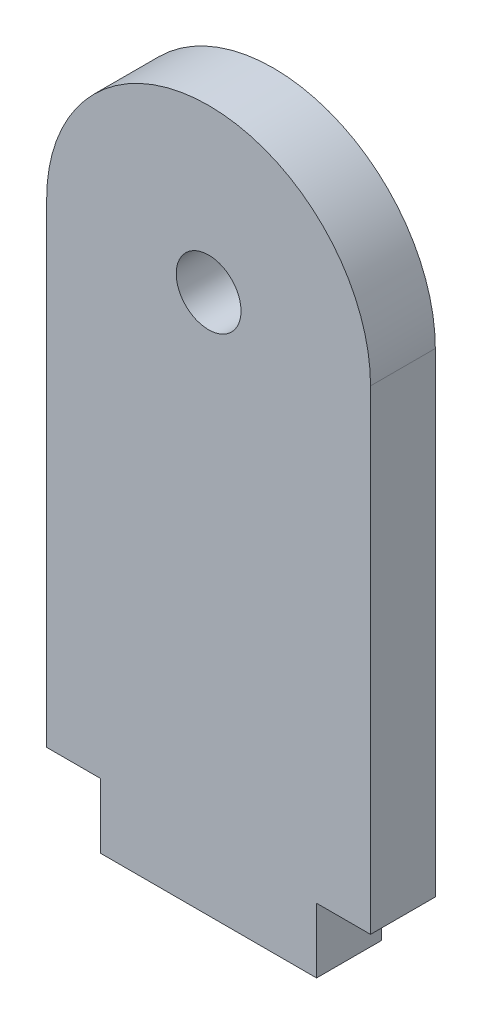
ISO-10303-21;
HEADER;
FILE_DESCRIPTION(('STEP AP214'),'2;1');
FILE_NAME('part.step','',(''),(''),'','','');
FILE_SCHEMA(('AUTOMOTIVE_DESIGN { 1 0 10303 214 1 1 1 1 }'));
ENDSEC;
DATA;
#1=APPLICATION_CONTEXT('core data for automotive mechanical design processes');
#2=APPLICATION_PROTOCOL_DEFINITION('international standard','automotive_design',2000,#1);
#3=PRODUCT_CONTEXT('',#1,'mechanical');
#4=PRODUCT('Part','Part','',(#3));
#5=PRODUCT_RELATED_PRODUCT_CATEGORY('part','',(#4));
#6=PRODUCT_DEFINITION_FORMATION('','',#4);
#7=PRODUCT_DEFINITION_CONTEXT('part definition',#1,'design');
#8=PRODUCT_DEFINITION('design','',#6,#7);
#9=PRODUCT_DEFINITION_SHAPE('','',#8);
#10=(LENGTH_UNIT() NAMED_UNIT(*) SI_UNIT(.MILLI.,.METRE.));
#11=(NAMED_UNIT(*) PLANE_ANGLE_UNIT() SI_UNIT($,.RADIAN.));
#12=(NAMED_UNIT(*) SI_UNIT($,.STERADIAN.) SOLID_ANGLE_UNIT());
#13=UNCERTAINTY_MEASURE_WITH_UNIT(LENGTH_MEASURE(1.E-05),#10,'distance_accuracy_value','');
#14=(GEOMETRIC_REPRESENTATION_CONTEXT(3) GLOBAL_UNCERTAINTY_ASSIGNED_CONTEXT((#13)) GLOBAL_UNIT_ASSIGNED_CONTEXT((#10,
#11,#12)) REPRESENTATION_CONTEXT('',''));
#15=CARTESIAN_POINT('',(0.,0.,0.));
#16=DIRECTION('',(0.,0.,1.));
#17=DIRECTION('',(1.,0.,0.));
#18=AXIS2_PLACEMENT_3D('',#15,#16,#17);
#19=CARTESIAN_POINT('',(12.5,0.,3.));
#20=DIRECTION('',(1.,0.,0.));
#21=DIRECTION('',(0.,0.,-1.));
#22=AXIS2_PLACEMENT_3D('',#19,#20,#21);
#23=PLANE('',#22);
#24=DIRECTION('',(0.,-1.,0.));
#25=VECTOR('',#24,1.);
#26=CARTESIAN_POINT('',(12.5,0.,0.));
#27=LINE('',#26,#25);
#28=CARTESIAN_POINT('',(12.5,-22.,0.));
#29=VERTEX_POINT('',#28);
#30=CARTESIAN_POINT('',(12.5,-25.,0.));
#31=VERTEX_POINT('',#30);
#32=EDGE_CURVE('E148',#29,#31,#27,.T.);
#33=ORIENTED_EDGE('',*,*,#32,.F.);
#34=DIRECTION('',(0.,0.,-1.));
#35=VECTOR('',#34,1.);
#36=CARTESIAN_POINT('',(12.5,-22.,3.));
#37=LINE('',#36,#35);
#38=CARTESIAN_POINT('',(12.5,-22.,3.));
#39=VERTEX_POINT('',#38);
#40=EDGE_CURVE('E11',#39,#29,#37,.T.);
#41=ORIENTED_EDGE('',*,*,#40,.F.);
#42=DIRECTION('',(0.,-1.,0.));
#43=VECTOR('',#42,1.);
#44=CARTESIAN_POINT('',(12.5,0.,3.));
#45=LINE('',#44,#43);
#46=CARTESIAN_POINT('',(12.5,-25.,3.));
#47=VERTEX_POINT('',#46);
#48=EDGE_CURVE('E177',#39,#47,#45,.T.);
#49=ORIENTED_EDGE('',*,*,#48,.T.);
#50=DIRECTION('',(0.,0.,-1.));
#51=VECTOR('',#50,1.);
#52=CARTESIAN_POINT('',(12.5,-25.,3.));
#53=LINE('',#52,#51);
#54=EDGE_CURVE('E97',#47,#31,#53,.T.);
#55=ORIENTED_EDGE('',*,*,#54,.T.);
#56=EDGE_LOOP('',(#33,#41,#49,#55));
#57=FACE_BOUND('',#56,.T.);
#58=ADVANCED_FACE('F45',(#57),#23,.T.);
#59=CARTESIAN_POINT('',(0.,-22.,3.));
#60=DIRECTION('',(0.,1.,0.));
#61=DIRECTION('',(0.,0.,1.));
#62=AXIS2_PLACEMENT_3D('',#59,#60,#61);
#63=PLANE('',#62);
#64=DIRECTION('',(1.,0.,0.));
#65=VECTOR('',#64,1.);
#66=CARTESIAN_POINT('',(0.,-22.,0.));
#67=LINE('',#66,#65);
#68=CARTESIAN_POINT('',(15.,-22.,0.));
#69=VERTEX_POINT('',#68);
#70=EDGE_CURVE('E152',#29,#69,#67,.T.);
#71=ORIENTED_EDGE('',*,*,#70,.T.);
#72=DIRECTION('',(0.,0.,-1.));
#73=VECTOR('',#72,1.);
#74=CARTESIAN_POINT('',(15.,-22.,3.));
#75=LINE('',#74,#73);
#76=CARTESIAN_POINT('',(15.,-22.,3.));
#77=VERTEX_POINT('',#76);
#78=EDGE_CURVE('E54',#77,#69,#75,.T.);
#79=ORIENTED_EDGE('',*,*,#78,.F.);
#80=DIRECTION('',(1.,0.,0.));
#81=VECTOR('',#80,1.);
#82=CARTESIAN_POINT('',(0.,-22.,3.));
#83=LINE('',#82,#81);
#84=EDGE_CURVE('E219',#39,#77,#83,.T.);
#85=ORIENTED_EDGE('',*,*,#84,.F.);
#86=ORIENTED_EDGE('',*,*,#40,.T.);
#87=EDGE_LOOP('',(#71,#79,#85,#86));
#88=FACE_BOUND('',#87,.T.);
#89=ADVANCED_FACE('F200',(#88),#63,.F.);
#90=CARTESIAN_POINT('',(15.,0.,3.));
#91=DIRECTION('',(1.,0.,0.));
#92=DIRECTION('',(0.,1.,0.));
#93=AXIS2_PLACEMENT_3D('',#90,#91,#92);
#94=PLANE('',#93);
#95=DIRECTION('',(0.,-1.,0.));
#96=VECTOR('',#95,1.);
#97=CARTESIAN_POINT('',(15.,0.,0.));
#98=LINE('',#97,#96);
#99=CARTESIAN_POINT('',(15.,0.,0.));
#100=VERTEX_POINT('',#99);
#101=EDGE_CURVE('E156',#100,#69,#98,.T.);
#102=ORIENTED_EDGE('',*,*,#101,.F.);
#103=DIRECTION('',(0.,0.,-1.));
#104=VECTOR('',#103,1.);
#105=CARTESIAN_POINT('',(15.,0.,3.));
#106=LINE('',#105,#104);
#107=CARTESIAN_POINT('',(15.,0.,3.));
#108=VERTEX_POINT('',#107);
#109=EDGE_CURVE('E188',#108,#100,#106,.T.);
#110=ORIENTED_EDGE('',*,*,#109,.F.);
#111=DIRECTION('',(0.,-1.,0.));
#112=VECTOR('',#111,1.);
#113=CARTESIAN_POINT('',(15.,0.,3.));
#114=LINE('',#113,#112);
#115=EDGE_CURVE('E197',#108,#77,#114,.T.);
#116=ORIENTED_EDGE('',*,*,#115,.T.);
#117=ORIENTED_EDGE('',*,*,#78,.T.);
#118=EDGE_LOOP('',(#102,#110,#116,#117));
#119=FACE_BOUND('',#118,.T.);
#120=ADVANCED_FACE('F195',(#119),#94,.T.);
#121=CARTESIAN_POINT('',(7.5,0.,3.));
#122=DIRECTION('',(0.,0.,-1.));
#123=DIRECTION('',(-1.,0.,0.));
#124=AXIS2_PLACEMENT_3D('',#121,#122,#123);
#125=CYLINDRICAL_SURFACE('',#124,7.5);
#126=CARTESIAN_POINT('',(7.5,0.,0.));
#127=DIRECTION('',(0.,0.,1.));
#128=DIRECTION('',(1.,0.,0.));
#129=AXIS2_PLACEMENT_3D('',#126,#127,#128);
#130=CIRCLE('',#129,7.5);
#131=CARTESIAN_POINT('',(0.,0.,0.));
#132=VERTEX_POINT('',#131);
#133=EDGE_CURVE('E160',#100,#132,#130,.T.);
#134=ORIENTED_EDGE('',*,*,#133,.T.);
#135=DIRECTION('',(0.,0.,-1.));
#136=VECTOR('',#135,1.);
#137=CARTESIAN_POINT('',(0.,0.,3.));
#138=LINE('',#137,#136);
#139=CARTESIAN_POINT('',(0.,0.,3.));
#140=VERTEX_POINT('',#139);
#141=EDGE_CURVE('E184',#140,#132,#138,.T.);
#142=ORIENTED_EDGE('',*,*,#141,.F.);
#143=CARTESIAN_POINT('',(7.5,0.,3.));
#144=DIRECTION('',(0.,0.,1.));
#145=DIRECTION('',(1.,0.,0.));
#146=AXIS2_PLACEMENT_3D('',#143,#144,#145);
#147=CIRCLE('',#146,7.5);
#148=EDGE_CURVE('E213',#108,#140,#147,.T.);
#149=ORIENTED_EDGE('',*,*,#148,.F.);
#150=ORIENTED_EDGE('',*,*,#109,.T.);
#151=EDGE_LOOP('',(#134,#142,#149,#150));
#152=FACE_BOUND('',#151,.T.);
#153=ADVANCED_FACE('F208',(#152),#125,.T.);
#154=CARTESIAN_POINT('',(0.,0.,3.));
#155=DIRECTION('',(1.,0.,0.));
#156=DIRECTION('',(0.,0.,-1.));
#157=AXIS2_PLACEMENT_3D('',#154,#155,#156);
#158=PLANE('',#157);
#159=DIRECTION('',(0.,-1.,0.));
#160=VECTOR('',#159,1.);
#161=CARTESIAN_POINT('',(0.,0.,0.));
#162=LINE('',#161,#160);
#163=CARTESIAN_POINT('',(0.,-22.,0.));
#164=VERTEX_POINT('',#163);
#165=EDGE_CURVE('E163',#132,#164,#162,.T.);
#166=ORIENTED_EDGE('',*,*,#165,.T.);
#167=DIRECTION('',(0.,0.,-1.));
#168=VECTOR('',#167,1.);
#169=CARTESIAN_POINT('',(0.,-22.,3.));
#170=LINE('',#169,#168);
#171=CARTESIAN_POINT('',(0.,-22.,3.));
#172=VERTEX_POINT('',#171);
#173=EDGE_CURVE('E134',#172,#164,#170,.T.);
#174=ORIENTED_EDGE('',*,*,#173,.F.);
#175=DIRECTION('',(0.,-1.,0.));
#176=VECTOR('',#175,1.);
#177=CARTESIAN_POINT('',(0.,0.,3.));
#178=LINE('',#177,#176);
#179=EDGE_CURVE('E123',#140,#172,#178,.T.);
#180=ORIENTED_EDGE('',*,*,#179,.F.);
#181=ORIENTED_EDGE('',*,*,#141,.T.);
#182=EDGE_LOOP('',(#166,#174,#180,#181));
#183=FACE_BOUND('',#182,.T.);
#184=ADVANCED_FACE('F211',(#183),#158,.F.);
#185=CARTESIAN_POINT('',(0.,-22.,3.));
#186=DIRECTION('',(0.,1.,0.));
#187=DIRECTION('',(0.,0.,1.));
#188=AXIS2_PLACEMENT_3D('',#185,#186,#187);
#189=PLANE('',#188);
#190=DIRECTION('',(1.,0.,0.));
#191=VECTOR('',#190,1.);
#192=CARTESIAN_POINT('',(0.,-22.,0.));
#193=LINE('',#192,#191);
#194=CARTESIAN_POINT('',(2.5,-22.,0.));
#195=VERTEX_POINT('',#194);
#196=EDGE_CURVE('E132',#164,#195,#193,.T.);
#197=ORIENTED_EDGE('',*,*,#196,.T.);
#198=DIRECTION('',(0.,0.,-1.));
#199=VECTOR('',#198,1.);
#200=CARTESIAN_POINT('',(2.5,-22.,3.));
#201=LINE('',#200,#199);
#202=CARTESIAN_POINT('',(2.5,-22.,3.));
#203=VERTEX_POINT('',#202);
#204=EDGE_CURVE('E129',#203,#195,#201,.T.);
#205=ORIENTED_EDGE('',*,*,#204,.F.);
#206=DIRECTION('',(1.,0.,0.));
#207=VECTOR('',#206,1.);
#208=CARTESIAN_POINT('',(0.,-22.,3.));
#209=LINE('',#208,#207);
#210=EDGE_CURVE('E116',#172,#203,#209,.T.);
#211=ORIENTED_EDGE('',*,*,#210,.F.);
#212=ORIENTED_EDGE('',*,*,#173,.T.);
#213=EDGE_LOOP('',(#197,#205,#211,#212));
#214=FACE_BOUND('',#213,.T.);
#215=ADVANCED_FACE('F130',(#214),#189,.F.);
#216=CARTESIAN_POINT('',(2.5,0.,3.));
#217=DIRECTION('',(1.,0.,0.));
#218=DIRECTION('',(0.,0.,-1.));
#219=AXIS2_PLACEMENT_3D('',#216,#217,#218);
#220=PLANE('',#219);
#221=DIRECTION('',(0.,-1.,0.));
#222=VECTOR('',#221,1.);
#223=CARTESIAN_POINT('',(2.5,0.,0.));
#224=LINE('',#223,#222);
#225=CARTESIAN_POINT('',(2.5,-25.,0.));
#226=VERTEX_POINT('',#225);
#227=EDGE_CURVE('E90',#195,#226,#224,.T.);
#228=ORIENTED_EDGE('',*,*,#227,.T.);
#229=DIRECTION('',(0.,0.,-1.));
#230=VECTOR('',#229,1.);
#231=CARTESIAN_POINT('',(2.5,-25.,3.));
#232=LINE('',#231,#230);
#233=CARTESIAN_POINT('',(2.5,-25.,3.));
#234=VERTEX_POINT('',#233);
#235=EDGE_CURVE('E135',#234,#226,#232,.T.);
#236=ORIENTED_EDGE('',*,*,#235,.F.);
#237=DIRECTION('',(0.,-1.,0.));
#238=VECTOR('',#237,1.);
#239=CARTESIAN_POINT('',(2.5,0.,3.));
#240=LINE('',#239,#238);
#241=EDGE_CURVE('E121',#203,#234,#240,.T.);
#242=ORIENTED_EDGE('',*,*,#241,.F.);
#243=ORIENTED_EDGE('',*,*,#204,.T.);
#244=EDGE_LOOP('',(#228,#236,#242,#243));
#245=FACE_BOUND('',#244,.T.);
#246=ADVANCED_FACE('F137',(#245),#220,.F.);
#247=CARTESIAN_POINT('',(0.,-25.,3.));
#248=DIRECTION('',(0.,1.,0.));
#249=DIRECTION('',(0.,0.,1.));
#250=AXIS2_PLACEMENT_3D('',#247,#248,#249);
#251=PLANE('',#250);
#252=DIRECTION('',(1.,0.,0.));
#253=VECTOR('',#252,1.);
#254=CARTESIAN_POINT('',(0.,-25.,0.));
#255=LINE('',#254,#253);
#256=EDGE_CURVE('E170',#226,#31,#255,.T.);
#257=ORIENTED_EDGE('',*,*,#256,.T.);
#258=ORIENTED_EDGE('',*,*,#54,.F.);
#259=DIRECTION('',(1.,0.,0.));
#260=VECTOR('',#259,1.);
#261=CARTESIAN_POINT('',(0.,-25.,3.));
#262=LINE('',#261,#260);
#263=EDGE_CURVE('E62',#234,#47,#262,.T.);
#264=ORIENTED_EDGE('',*,*,#263,.F.);
#265=ORIENTED_EDGE('',*,*,#235,.T.);
#266=EDGE_LOOP('',(#257,#258,#264,#265));
#267=FACE_BOUND('',#266,.T.);
#268=ADVANCED_FACE('F240',(#267),#251,.F.);
#269=CARTESIAN_POINT('',(7.5,0.,3.));
#270=DIRECTION('',(0.,0.,-1.));
#271=DIRECTION('',(-1.,0.,0.));
#272=AXIS2_PLACEMENT_3D('',#269,#270,#271);
#273=CYLINDRICAL_SURFACE('',#272,1.5);
#274=CARTESIAN_POINT('',(7.5,0.,3.));
#275=DIRECTION('',(0.,0.,1.));
#276=DIRECTION('',(1.,0.,0.));
#277=AXIS2_PLACEMENT_3D('',#274,#275,#276);
#278=CIRCLE('',#277,1.5);
#279=CARTESIAN_POINT('',(9.,0.,3.));
#280=VERTEX_POINT('',#279);
#281=EDGE_CURVE('E141',#280,#280,#278,.T.);
#282=ORIENTED_EDGE('',*,*,#281,.T.);
#283=EDGE_LOOP('',(#282));
#284=FACE_BOUND('',#283,.T.);
#285=CARTESIAN_POINT('',(7.5,0.,0.));
#286=DIRECTION('',(0.,0.,1.));
#287=DIRECTION('',(1.,0.,0.));
#288=AXIS2_PLACEMENT_3D('',#285,#286,#287);
#289=CIRCLE('',#288,1.5);
#290=CARTESIAN_POINT('',(9.,0.,0.));
#291=VERTEX_POINT('',#290);
#292=EDGE_CURVE('E173',#291,#291,#289,.T.);
#293=ORIENTED_EDGE('',*,*,#292,.F.);
#294=EDGE_LOOP('',(#293));
#295=FACE_BOUND('',#294,.T.);
#296=ADVANCED_FACE('F243',(#284,#295),#273,.F.);
#297=CARTESIAN_POINT('',(0.,0.,3.));
#298=DIRECTION('',(0.,0.,1.));
#299=DIRECTION('',(1.,0.,0.));
#300=AXIS2_PLACEMENT_3D('',#297,#298,#299);
#301=PLANE('',#300);
#302=ORIENTED_EDGE('',*,*,#48,.F.);
#303=ORIENTED_EDGE('',*,*,#84,.T.);
#304=ORIENTED_EDGE('',*,*,#115,.F.);
#305=ORIENTED_EDGE('',*,*,#148,.T.);
#306=ORIENTED_EDGE('',*,*,#179,.T.);
#307=ORIENTED_EDGE('',*,*,#210,.T.);
#308=ORIENTED_EDGE('',*,*,#241,.T.);
#309=ORIENTED_EDGE('',*,*,#263,.T.);
#310=EDGE_LOOP('',(#302,#303,#304,#305,#306,#307,#308,#309));
#311=FACE_BOUND('',#310,.T.);
#312=ORIENTED_EDGE('',*,*,#281,.F.);
#313=EDGE_LOOP('',(#312));
#314=FACE_BOUND('',#313,.T.);
#315=ADVANCED_FACE('F118',(#311,#314),#301,.T.);
#316=CARTESIAN_POINT('',(0.,0.,0.));
#317=DIRECTION('',(0.,0.,1.));
#318=DIRECTION('',(1.,0.,0.));
#319=AXIS2_PLACEMENT_3D('',#316,#317,#318);
#320=PLANE('',#319);
#321=ORIENTED_EDGE('',*,*,#32,.T.);
#322=ORIENTED_EDGE('',*,*,#256,.F.);
#323=ORIENTED_EDGE('',*,*,#227,.F.);
#324=ORIENTED_EDGE('',*,*,#196,.F.);
#325=ORIENTED_EDGE('',*,*,#165,.F.);
#326=ORIENTED_EDGE('',*,*,#133,.F.);
#327=ORIENTED_EDGE('',*,*,#101,.T.);
#328=ORIENTED_EDGE('',*,*,#70,.F.);
#329=EDGE_LOOP('',(#321,#322,#323,#324,#325,#326,#327,#328));
#330=FACE_BOUND('',#329,.T.);
#331=ORIENTED_EDGE('',*,*,#292,.T.);
#332=EDGE_LOOP('',(#331));
#333=FACE_BOUND('',#332,.T.);
#334=ADVANCED_FACE('F203',(#330,#333),#320,.F.);
#335=CLOSED_SHELL('',(#58,#89,#120,#153,#184,#215,#246,#268,#296,#315,#334));
#336=MANIFOLD_SOLID_BREP('B2',#335);
#337=ADVANCED_BREP_SHAPE_REPRESENTATION('',(#18,#336),#14);
#338=SHAPE_DEFINITION_REPRESENTATION(#9,#337);
ENDSEC;
END-ISO-10303-21;
